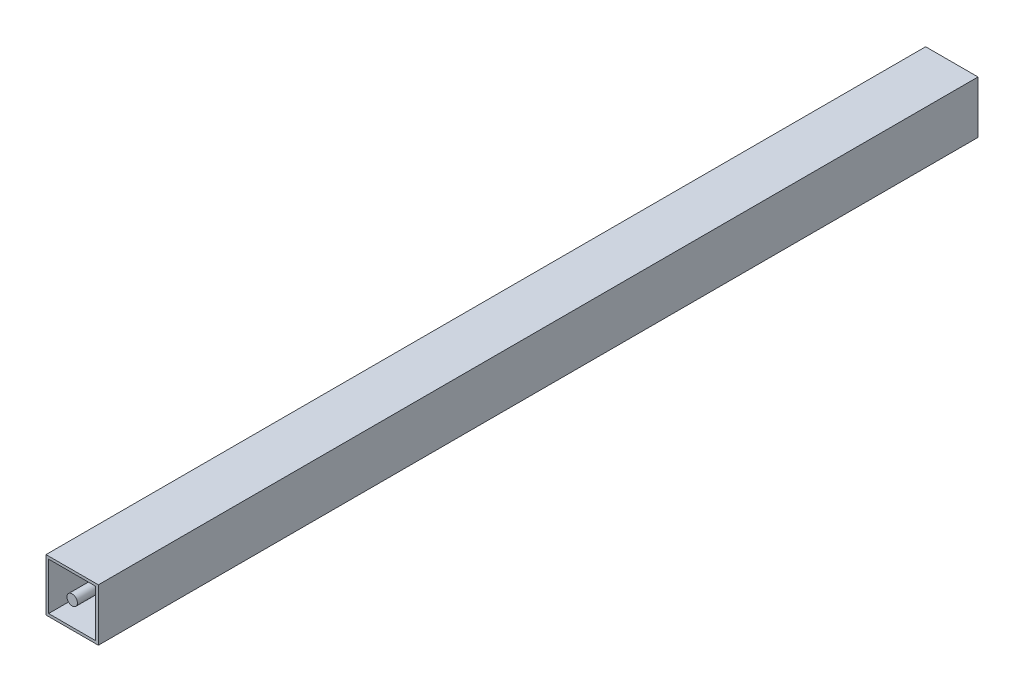
ISO-10303-21;
HEADER;
FILE_DESCRIPTION(('STEP AP214'),'2;1');
FILE_NAME('part.step','',(''),(''),'','','');
FILE_SCHEMA(('AUTOMOTIVE_DESIGN { 1 0 10303 214 1 1 1 1 }'));
ENDSEC;
DATA;
#1=APPLICATION_CONTEXT('core data for automotive mechanical design processes');
#2=APPLICATION_PROTOCOL_DEFINITION('international standard','automotive_design',2000,#1);
#3=PRODUCT_CONTEXT('',#1,'mechanical');
#4=PRODUCT('Part','Part','',(#3));
#5=PRODUCT_RELATED_PRODUCT_CATEGORY('part','',(#4));
#6=PRODUCT_DEFINITION_FORMATION('','',#4);
#7=PRODUCT_DEFINITION_CONTEXT('part definition',#1,'design');
#8=PRODUCT_DEFINITION('design','',#6,#7);
#9=PRODUCT_DEFINITION_SHAPE('','',#8);
#10=(LENGTH_UNIT() NAMED_UNIT(*) SI_UNIT(.MILLI.,.METRE.));
#11=(NAMED_UNIT(*) PLANE_ANGLE_UNIT() SI_UNIT($,.RADIAN.));
#12=(NAMED_UNIT(*) SI_UNIT($,.STERADIAN.) SOLID_ANGLE_UNIT());
#13=UNCERTAINTY_MEASURE_WITH_UNIT(LENGTH_MEASURE(1.E-05),#10,'distance_accuracy_value','');
#14=(GEOMETRIC_REPRESENTATION_CONTEXT(3) GLOBAL_UNCERTAINTY_ASSIGNED_CONTEXT((#13)) GLOBAL_UNIT_ASSIGNED_CONTEXT((#10,
#11,#12)) REPRESENTATION_CONTEXT('',''));
#15=CARTESIAN_POINT('',(0.,0.,0.));
#16=DIRECTION('',(0.,0.,1.));
#17=DIRECTION('',(1.,0.,0.));
#18=AXIS2_PLACEMENT_3D('',#15,#16,#17);
#19=CARTESIAN_POINT('',(4.5,4.5,168.));
#20=DIRECTION('',(0.,0.,-1.));
#21=DIRECTION('',(-1.,0.,0.));
#22=AXIS2_PLACEMENT_3D('',#19,#20,#21);
#23=CYLINDRICAL_SURFACE('',#22,1.);
#24=CARTESIAN_POINT('',(4.5,4.5,168.));
#25=DIRECTION('',(0.,0.,1.));
#26=DIRECTION('',(1.,0.,0.));
#27=AXIS2_PLACEMENT_3D('',#24,#25,#26);
#28=CIRCLE('',#27,1.);
#29=CARTESIAN_POINT('',(3.5,4.5,168.));
#30=VERTEX_POINT('',#29);
#31=EDGE_CURVE('E12',#30,#30,#28,.T.);
#32=CARTESIAN_POINT('',(4.5,4.5,0.));
#33=DIRECTION('',(0.,0.,1.));
#34=DIRECTION('',(1.,0.,0.));
#35=AXIS2_PLACEMENT_3D('',#32,#33,#34);
#36=CIRCLE('',#35,1.);
#37=CARTESIAN_POINT('',(3.5,4.5,0.));
#38=VERTEX_POINT('',#37);
#39=EDGE_CURVE('E62',#38,#38,#36,.T.);
#40=CARTESIAN_POINT('',(3.5,4.5,168.));
#41=CARTESIAN_POINT('',(3.5,4.5,166.25));
#42=CARTESIAN_POINT('',(3.5,4.5,164.5));
#43=CARTESIAN_POINT('',(3.5,4.5,161.));
#44=CARTESIAN_POINT('',(3.5,4.5,159.25));
#45=CARTESIAN_POINT('',(3.5,4.5,155.75));
#46=CARTESIAN_POINT('',(3.5,4.5,154.));
#47=CARTESIAN_POINT('',(3.5,4.5,150.5));
#48=CARTESIAN_POINT('',(3.5,4.5,148.75));
#49=CARTESIAN_POINT('',(3.5,4.5,145.25));
#50=CARTESIAN_POINT('',(3.5,4.5,143.5));
#51=CARTESIAN_POINT('',(3.5,4.5,140.));
#52=CARTESIAN_POINT('',(3.5,4.5,138.25));
#53=CARTESIAN_POINT('',(3.5,4.5,134.75));
#54=CARTESIAN_POINT('',(3.5,4.5,133.));
#55=CARTESIAN_POINT('',(3.5,4.5,129.5));
#56=CARTESIAN_POINT('',(3.5,4.5,127.75));
#57=CARTESIAN_POINT('',(3.5,4.5,124.25));
#58=CARTESIAN_POINT('',(3.5,4.5,122.5));
#59=CARTESIAN_POINT('',(3.5,4.5,119.));
#60=CARTESIAN_POINT('',(3.5,4.5,117.25));
#61=CARTESIAN_POINT('',(3.5,4.5,113.75));
#62=CARTESIAN_POINT('',(3.5,4.5,112.));
#63=CARTESIAN_POINT('',(3.5,4.5,108.5));
#64=CARTESIAN_POINT('',(3.5,4.5,106.75));
#65=CARTESIAN_POINT('',(3.5,4.5,103.25));
#66=CARTESIAN_POINT('',(3.5,4.5,101.5));
#67=CARTESIAN_POINT('',(3.5,4.5,98.));
#68=CARTESIAN_POINT('',(3.5,4.5,96.25));
#69=CARTESIAN_POINT('',(3.5,4.5,92.75));
#70=CARTESIAN_POINT('',(3.5,4.5,91.));
#71=CARTESIAN_POINT('',(3.5,4.5,87.5));
#72=CARTESIAN_POINT('',(3.5,4.5,85.75));
#73=CARTESIAN_POINT('',(3.5,4.5,82.25));
#74=CARTESIAN_POINT('',(3.5,4.5,80.5));
#75=CARTESIAN_POINT('',(3.5,4.5,77.));
#76=CARTESIAN_POINT('',(3.5,4.5,75.25));
#77=CARTESIAN_POINT('',(3.5,4.5,71.75));
#78=CARTESIAN_POINT('',(3.5,4.5,70.));
#79=CARTESIAN_POINT('',(3.5,4.5,66.5));
#80=CARTESIAN_POINT('',(3.5,4.5,64.75));
#81=CARTESIAN_POINT('',(3.5,4.5,61.25));
#82=CARTESIAN_POINT('',(3.5,4.5,59.5));
#83=CARTESIAN_POINT('',(3.5,4.5,56.));
#84=CARTESIAN_POINT('',(3.5,4.5,54.25));
#85=CARTESIAN_POINT('',(3.5,4.5,50.75));
#86=CARTESIAN_POINT('',(3.5,4.5,49.));
#87=CARTESIAN_POINT('',(3.5,4.5,45.5));
#88=CARTESIAN_POINT('',(3.5,4.5,43.75));
#89=CARTESIAN_POINT('',(3.5,4.5,40.25));
#90=CARTESIAN_POINT('',(3.5,4.5,38.5));
#91=CARTESIAN_POINT('',(3.5,4.5,35.));
#92=CARTESIAN_POINT('',(3.5,4.5,33.25));
#93=CARTESIAN_POINT('',(3.5,4.5,29.75));
#94=CARTESIAN_POINT('',(3.5,4.5,28.));
#95=CARTESIAN_POINT('',(3.5,4.5,24.5));
#96=CARTESIAN_POINT('',(3.5,4.5,22.75));
#97=CARTESIAN_POINT('',(3.5,4.5,19.25));
#98=CARTESIAN_POINT('',(3.5,4.5,17.5));
#99=CARTESIAN_POINT('',(3.5,4.5,14.));
#100=CARTESIAN_POINT('',(3.5,4.5,12.25));
#101=CARTESIAN_POINT('',(3.5,4.5,8.75000000000001));
#102=CARTESIAN_POINT('',(3.5,4.5,7.00000000000001));
#103=CARTESIAN_POINT('',(3.5,4.5,3.5));
#104=CARTESIAN_POINT('',(3.5,4.5,1.75));
#105=CARTESIAN_POINT('',(3.5,4.5,0.));
#106=B_SPLINE_CURVE_WITH_KNOTS('',3,(#40,#41,#42,#43,#44,#45,#46,#47,#48,#49,#50,#51,#52,#53,
#54,#55,#56,#57,#58,#59,#60,#61,#62,#63,#64,#65,#66,#67,#68,#69,#70,#71,#72,#73,#74,#75,#76,#77,
#78,#79,#80,#81,#82,#83,#84,#85,#86,#87,#88,#89,#90,#91,#92,#93,#94,#95,#96,#97,#98,#99,#100,
#101,#102,#103,#104,#105),.UNSPECIFIED.,.F.,.F.,(4,2,2,2,2,2,2,2,2,2,2,2,2,2,2,2,2,2,2,2,2,2,2,
2,2,2,2,2,2,2,2,2,4),(0.,5.24999999999998,10.5,15.75,21.,26.25,31.5,36.75,42.,47.25,52.5,57.75,
63.,68.25,73.5,78.75,84.,89.25,94.5,99.75,105.,110.25,115.5,120.75,126.,131.25,136.5,141.75,
147.,152.25,157.5,162.75,168.),.UNSPECIFIED.);
#107=EDGE_CURVE('BSEAM59',#30,#38,#106,.T.);
#108=ORIENTED_EDGE('',*,*,#31,.F.);
#109=ORIENTED_EDGE('',*,*,#39,.T.);
#110=ORIENTED_EDGE('',*,*,#107,.T.);
#111=ORIENTED_EDGE('',*,*,#107,.F.);
#112=EDGE_LOOP('',(#108,#110,#109,#111));
#113=FACE_BOUND('',#112,.T.);
#114=ADVANCED_FACE('F59',(#113),#23,.T.);
#115=CARTESIAN_POINT('',(0.,0.,168.));
#116=DIRECTION('',(0.,0.,1.));
#117=DIRECTION('',(1.,0.,0.));
#118=AXIS2_PLACEMENT_3D('',#115,#116,#117);
#119=PLANE('',#118);
#120=ORIENTED_EDGE('',*,*,#31,.T.);
#121=EDGE_LOOP('',(#120));
#122=FACE_BOUND('',#121,.T.);
#123=ADVANCED_FACE('F74',(#122),#119,.T.);
#124=CARTESIAN_POINT('',(0.,0.,0.));
#125=DIRECTION('',(0.,0.,1.));
#126=DIRECTION('',(1.,0.,0.));
#127=AXIS2_PLACEMENT_3D('',#124,#125,#126);
#128=PLANE('',#127);
#129=ORIENTED_EDGE('',*,*,#39,.F.);
#130=EDGE_LOOP('',(#129));
#131=FACE_BOUND('',#130,.T.);
#132=ADVANCED_FACE('F72',(#131),#128,.F.);
#133=CLOSED_SHELL('',(#114,#123,#132));
#134=MANIFOLD_SOLID_BREP('B2',#133);
#135=CARTESIAN_POINT('',(9.,0.,168.));
#136=DIRECTION('',(-1.,0.,0.));
#137=DIRECTION('',(0.,0.,1.));
#138=AXIS2_PLACEMENT_3D('',#135,#136,#137);
#139=PLANE('',#138);
#140=DIRECTION('',(0.,1.,0.));
#141=VECTOR('',#140,1.);
#142=CARTESIAN_POINT('',(9.,0.,0.));
#143=LINE('',#142,#141);
#144=CARTESIAN_POINT('',(9.,0.,0.));
#145=VERTEX_POINT('',#144);
#146=CARTESIAN_POINT('',(9.,9.,0.));
#147=VERTEX_POINT('',#146);
#148=EDGE_CURVE('E210',#145,#147,#143,.T.);
#149=ORIENTED_EDGE('',*,*,#148,.F.);
#150=DIRECTION('',(0.,0.,-1.));
#151=VECTOR('',#150,1.);
#152=CARTESIAN_POINT('',(9.,0.,168.));
#153=LINE('',#152,#151);
#154=CARTESIAN_POINT('',(9.,0.,168.));
#155=VERTEX_POINT('',#154);
#156=EDGE_CURVE('E57',#155,#145,#153,.T.);
#157=ORIENTED_EDGE('',*,*,#156,.F.);
#158=DIRECTION('',(0.,1.,0.));
#159=VECTOR('',#158,1.);
#160=CARTESIAN_POINT('',(9.,0.,168.));
#161=LINE('',#160,#159);
#162=CARTESIAN_POINT('',(9.,9.,168.));
#163=VERTEX_POINT('',#162);
#164=EDGE_CURVE('E191',#155,#163,#161,.T.);
#165=ORIENTED_EDGE('',*,*,#164,.T.);
#166=DIRECTION('',(0.,0.,-1.));
#167=VECTOR('',#166,1.);
#168=CARTESIAN_POINT('',(9.,9.,168.));
#169=LINE('',#168,#167);
#170=EDGE_CURVE('E153',#163,#147,#169,.T.);
#171=ORIENTED_EDGE('',*,*,#170,.T.);
#172=EDGE_LOOP('',(#149,#157,#165,#171));
#173=FACE_BOUND('',#172,.T.);
#174=ADVANCED_FACE('F99',(#173),#139,.T.);
#175=CARTESIAN_POINT('',(0.,0.,168.));
#176=DIRECTION('',(0.,1.,0.));
#177=DIRECTION('',(0.,0.,1.));
#178=AXIS2_PLACEMENT_3D('',#175,#176,#177);
#179=PLANE('',#178);
#180=DIRECTION('',(1.,0.,0.));
#181=VECTOR('',#180,1.);
#182=CARTESIAN_POINT('',(0.,0.,0.));
#183=LINE('',#182,#181);
#184=CARTESIAN_POINT('',(0.,0.,0.));
#185=VERTEX_POINT('',#184);
#186=EDGE_CURVE('E181',#185,#145,#183,.T.);
#187=ORIENTED_EDGE('',*,*,#186,.F.);
#188=DIRECTION('',(0.,0.,-1.));
#189=VECTOR('',#188,1.);
#190=CARTESIAN_POINT('',(0.,0.,168.));
#191=LINE('',#190,#189);
#192=CARTESIAN_POINT('',(0.,0.,168.));
#193=VERTEX_POINT('',#192);
#194=EDGE_CURVE('E109',#193,#185,#191,.T.);
#195=ORIENTED_EDGE('',*,*,#194,.F.);
#196=DIRECTION('',(1.,0.,0.));
#197=VECTOR('',#196,1.);
#198=CARTESIAN_POINT('',(0.,0.,168.));
#199=LINE('',#198,#197);
#200=EDGE_CURVE('E179',#193,#155,#199,.T.);
#201=ORIENTED_EDGE('',*,*,#200,.T.);
#202=ORIENTED_EDGE('',*,*,#156,.T.);
#203=EDGE_LOOP('',(#187,#195,#201,#202));
#204=FACE_BOUND('',#203,.T.);
#205=ADVANCED_FACE('F177',(#204),#179,.T.);
#206=CARTESIAN_POINT('',(0.,0.,168.));
#207=DIRECTION('',(-1.,0.,0.));
#208=DIRECTION('',(0.,0.,1.));
#209=AXIS2_PLACEMENT_3D('',#206,#207,#208);
#210=PLANE('',#209);
#211=DIRECTION('',(0.,1.,0.));
#212=VECTOR('',#211,1.);
#213=CARTESIAN_POINT('',(0.,0.,0.));
#214=LINE('',#213,#212);
#215=CARTESIAN_POINT('',(0.,9.,0.));
#216=VERTEX_POINT('',#215);
#217=EDGE_CURVE('E213',#185,#216,#214,.T.);
#218=ORIENTED_EDGE('',*,*,#217,.T.);
#219=DIRECTION('',(0.,0.,-1.));
#220=VECTOR('',#219,1.);
#221=CARTESIAN_POINT('',(0.,9.,168.));
#222=LINE('',#221,#220);
#223=CARTESIAN_POINT('',(0.,9.,168.));
#224=VERTEX_POINT('',#223);
#225=EDGE_CURVE('E184',#224,#216,#222,.T.);
#226=ORIENTED_EDGE('',*,*,#225,.F.);
#227=DIRECTION('',(0.,1.,0.));
#228=VECTOR('',#227,1.);
#229=CARTESIAN_POINT('',(0.,0.,168.));
#230=LINE('',#229,#228);
#231=EDGE_CURVE('E187',#193,#224,#230,.T.);
#232=ORIENTED_EDGE('',*,*,#231,.F.);
#233=ORIENTED_EDGE('',*,*,#194,.T.);
#234=EDGE_LOOP('',(#218,#226,#232,#233));
#235=FACE_BOUND('',#234,.T.);
#236=ADVANCED_FACE('F188',(#235),#210,.F.);
#237=CARTESIAN_POINT('',(9.5,0.,168.));
#238=DIRECTION('',(1.,0.,0.));
#239=DIRECTION('',(0.,0.,-1.));
#240=AXIS2_PLACEMENT_3D('',#237,#238,#239);
#241=PLANE('',#240);
#242=DIRECTION('',(0.,-1.,0.));
#243=VECTOR('',#242,1.);
#244=CARTESIAN_POINT('',(9.5,0.,0.));
#245=LINE('',#244,#243);
#246=CARTESIAN_POINT('',(9.5,9.5,0.));
#247=VERTEX_POINT('',#246);
#248=CARTESIAN_POINT('',(9.5,-0.5,0.));
#249=VERTEX_POINT('',#248);
#250=EDGE_CURVE('E199',#247,#249,#245,.T.);
#251=ORIENTED_EDGE('',*,*,#250,.F.);
#252=DIRECTION('',(0.,0.,-1.));
#253=VECTOR('',#252,1.);
#254=CARTESIAN_POINT('',(9.5,9.5,168.));
#255=LINE('',#254,#253);
#256=CARTESIAN_POINT('',(9.5,9.5,168.));
#257=VERTEX_POINT('',#256);
#258=EDGE_CURVE('E103',#257,#247,#255,.T.);
#259=ORIENTED_EDGE('',*,*,#258,.F.);
#260=DIRECTION('',(0.,-1.,0.));
#261=VECTOR('',#260,1.);
#262=CARTESIAN_POINT('',(9.5,0.,168.));
#263=LINE('',#262,#261);
#264=CARTESIAN_POINT('',(9.5,-0.5,168.));
#265=VERTEX_POINT('',#264);
#266=EDGE_CURVE('E216',#257,#265,#263,.T.);
#267=ORIENTED_EDGE('',*,*,#266,.T.);
#268=DIRECTION('',(0.,0.,-1.));
#269=VECTOR('',#268,1.);
#270=CARTESIAN_POINT('',(9.5,-0.5,168.));
#271=LINE('',#270,#269);
#272=EDGE_CURVE('E198',#265,#249,#271,.T.);
#273=ORIENTED_EDGE('',*,*,#272,.T.);
#274=EDGE_LOOP('',(#251,#259,#267,#273));
#275=FACE_BOUND('',#274,.T.);
#276=ADVANCED_FACE('F101',(#275),#241,.T.);
#277=CARTESIAN_POINT('',(0.,9.5,168.));
#278=DIRECTION('',(0.,1.,0.));
#279=DIRECTION('',(0.,0.,1.));
#280=AXIS2_PLACEMENT_3D('',#277,#278,#279);
#281=PLANE('',#280);
#282=DIRECTION('',(1.,0.,0.));
#283=VECTOR('',#282,1.);
#284=CARTESIAN_POINT('',(0.,9.5,0.));
#285=LINE('',#284,#283);
#286=CARTESIAN_POINT('',(-0.500000000000001,9.5,0.));
#287=VERTEX_POINT('',#286);
#288=EDGE_CURVE('E202',#287,#247,#285,.T.);
#289=ORIENTED_EDGE('',*,*,#288,.F.);
#290=DIRECTION('',(0.,0.,-1.));
#291=VECTOR('',#290,1.);
#292=CARTESIAN_POINT('',(-0.500000000000001,9.5,168.));
#293=LINE('',#292,#291);
#294=CARTESIAN_POINT('',(-0.500000000000001,9.5,168.));
#295=VERTEX_POINT('',#294);
#296=EDGE_CURVE('E222',#295,#287,#293,.T.);
#297=ORIENTED_EDGE('',*,*,#296,.F.);
#298=DIRECTION('',(1.,0.,0.));
#299=VECTOR('',#298,1.);
#300=CARTESIAN_POINT('',(0.,9.5,168.));
#301=LINE('',#300,#299);
#302=EDGE_CURVE('E231',#295,#257,#301,.T.);
#303=ORIENTED_EDGE('',*,*,#302,.T.);
#304=ORIENTED_EDGE('',*,*,#258,.T.);
#305=EDGE_LOOP('',(#289,#297,#303,#304));
#306=FACE_BOUND('',#305,.T.);
#307=ADVANCED_FACE('F229',(#306),#281,.T.);
#308=CARTESIAN_POINT('',(-0.500000000000001,0.,168.));
#309=DIRECTION('',(1.,0.,0.));
#310=DIRECTION('',(0.,0.,-1.));
#311=AXIS2_PLACEMENT_3D('',#308,#309,#310);
#312=PLANE('',#311);
#313=DIRECTION('',(0.,-1.,0.));
#314=VECTOR('',#313,1.);
#315=CARTESIAN_POINT('',(-0.500000000000001,0.,0.));
#316=LINE('',#315,#314);
#317=CARTESIAN_POINT('',(-0.500000000000001,-0.5,0.));
#318=VERTEX_POINT('',#317);
#319=EDGE_CURVE('E205',#287,#318,#316,.T.);
#320=ORIENTED_EDGE('',*,*,#319,.T.);
#321=DIRECTION('',(0.,0.,-1.));
#322=VECTOR('',#321,1.);
#323=CARTESIAN_POINT('',(-0.500000000000001,-0.5,168.));
#324=LINE('',#323,#322);
#325=CARTESIAN_POINT('',(-0.500000000000001,-0.5,168.));
#326=VERTEX_POINT('',#325);
#327=EDGE_CURVE('E220',#326,#318,#324,.T.);
#328=ORIENTED_EDGE('',*,*,#327,.F.);
#329=DIRECTION('',(0.,-1.,0.));
#330=VECTOR('',#329,1.);
#331=CARTESIAN_POINT('',(-0.500000000000001,0.,168.));
#332=LINE('',#331,#330);
#333=EDGE_CURVE('E242',#295,#326,#332,.T.);
#334=ORIENTED_EDGE('',*,*,#333,.F.);
#335=ORIENTED_EDGE('',*,*,#296,.T.);
#336=EDGE_LOOP('',(#320,#328,#334,#335));
#337=FACE_BOUND('',#336,.T.);
#338=ADVANCED_FACE('F237',(#337),#312,.F.);
#339=CARTESIAN_POINT('',(0.,-0.5,168.));
#340=DIRECTION('',(0.,1.,0.));
#341=DIRECTION('',(0.,0.,1.));
#342=AXIS2_PLACEMENT_3D('',#339,#340,#341);
#343=PLANE('',#342);
#344=DIRECTION('',(1.,0.,0.));
#345=VECTOR('',#344,1.);
#346=CARTESIAN_POINT('',(0.,-0.5,0.));
#347=LINE('',#346,#345);
#348=EDGE_CURVE('E207',#318,#249,#347,.T.);
#349=ORIENTED_EDGE('',*,*,#348,.T.);
#350=ORIENTED_EDGE('',*,*,#272,.F.);
#351=DIRECTION('',(1.,0.,0.));
#352=VECTOR('',#351,1.);
#353=CARTESIAN_POINT('',(0.,-0.5,168.));
#354=LINE('',#353,#352);
#355=EDGE_CURVE('E193',#326,#265,#354,.T.);
#356=ORIENTED_EDGE('',*,*,#355,.F.);
#357=ORIENTED_EDGE('',*,*,#327,.T.);
#358=EDGE_LOOP('',(#349,#350,#356,#357));
#359=FACE_BOUND('',#358,.T.);
#360=ADVANCED_FACE('F240',(#359),#343,.F.);
#361=CARTESIAN_POINT('',(0.,9.,168.));
#362=DIRECTION('',(0.,1.,0.));
#363=DIRECTION('',(0.,0.,1.));
#364=AXIS2_PLACEMENT_3D('',#361,#362,#363);
#365=PLANE('',#364);
#366=DIRECTION('',(1.,0.,0.));
#367=VECTOR('',#366,1.);
#368=CARTESIAN_POINT('',(0.,9.,0.));
#369=LINE('',#368,#367);
#370=EDGE_CURVE('E146',#216,#147,#369,.T.);
#371=ORIENTED_EDGE('',*,*,#370,.T.);
#372=ORIENTED_EDGE('',*,*,#170,.F.);
#373=DIRECTION('',(1.,0.,0.));
#374=VECTOR('',#373,1.);
#375=CARTESIAN_POINT('',(0.,9.,168.));
#376=LINE('',#375,#374);
#377=EDGE_CURVE('E118',#224,#163,#376,.T.);
#378=ORIENTED_EDGE('',*,*,#377,.F.);
#379=ORIENTED_EDGE('',*,*,#225,.T.);
#380=EDGE_LOOP('',(#371,#372,#378,#379));
#381=FACE_BOUND('',#380,.T.);
#382=ADVANCED_FACE('F247',(#381),#365,.F.);
#383=CARTESIAN_POINT('',(0.,0.,168.));
#384=DIRECTION('',(0.,0.,1.));
#385=DIRECTION('',(1.,0.,0.));
#386=AXIS2_PLACEMENT_3D('',#383,#384,#385);
#387=PLANE('',#386);
#388=ORIENTED_EDGE('',*,*,#266,.F.);
#389=ORIENTED_EDGE('',*,*,#302,.F.);
#390=ORIENTED_EDGE('',*,*,#333,.T.);
#391=ORIENTED_EDGE('',*,*,#355,.T.);
#392=EDGE_LOOP('',(#388,#389,#390,#391));
#393=FACE_BOUND('',#392,.T.);
#394=ORIENTED_EDGE('',*,*,#164,.F.);
#395=ORIENTED_EDGE('',*,*,#200,.F.);
#396=ORIENTED_EDGE('',*,*,#231,.T.);
#397=ORIENTED_EDGE('',*,*,#377,.T.);
#398=EDGE_LOOP('',(#394,#395,#396,#397));
#399=FACE_BOUND('',#398,.T.);
#400=ADVANCED_FACE('F190',(#393,#399),#387,.T.);
#401=CARTESIAN_POINT('',(0.,0.,0.));
#402=DIRECTION('',(0.,0.,1.));
#403=DIRECTION('',(1.,0.,0.));
#404=AXIS2_PLACEMENT_3D('',#401,#402,#403);
#405=PLANE('',#404);
#406=ORIENTED_EDGE('',*,*,#250,.T.);
#407=ORIENTED_EDGE('',*,*,#348,.F.);
#408=ORIENTED_EDGE('',*,*,#319,.F.);
#409=ORIENTED_EDGE('',*,*,#288,.T.);
#410=EDGE_LOOP('',(#406,#407,#408,#409));
#411=FACE_BOUND('',#410,.T.);
#412=ORIENTED_EDGE('',*,*,#148,.T.);
#413=ORIENTED_EDGE('',*,*,#370,.F.);
#414=ORIENTED_EDGE('',*,*,#217,.F.);
#415=ORIENTED_EDGE('',*,*,#186,.T.);
#416=EDGE_LOOP('',(#412,#413,#414,#415));
#417=FACE_BOUND('',#416,.T.);
#418=ADVANCED_FACE('F235',(#411,#417),#405,.F.);
#419=CLOSED_SHELL('',(#174,#205,#236,#276,#307,#338,#360,#382,#400,#418));
#420=MANIFOLD_SOLID_BREP('B7',#419);
#421=ADVANCED_BREP_SHAPE_REPRESENTATION('',(#18,#134,#420),#14);
#422=SHAPE_DEFINITION_REPRESENTATION(#9,#421);
ENDSEC;
END-ISO-10303-21;
